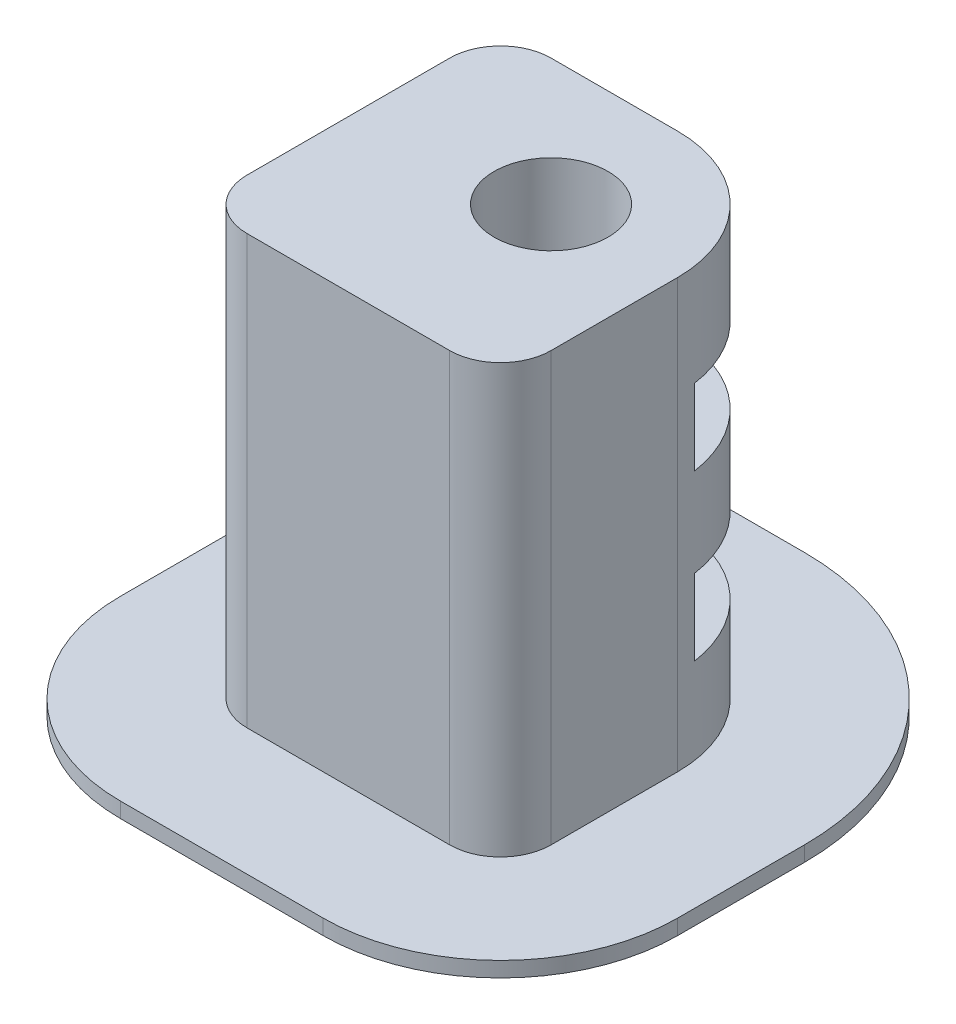
ISO-10303-21;
HEADER;
FILE_DESCRIPTION(('STEP AP214'),'2;1');
FILE_NAME('part.step','',(''),(''),'','','');
FILE_SCHEMA(('AUTOMOTIVE_DESIGN { 1 0 10303 214 1 1 1 1 }'));
ENDSEC;
DATA;
#1=APPLICATION_CONTEXT('core data for automotive mechanical design processes');
#2=APPLICATION_PROTOCOL_DEFINITION('international standard','automotive_design',2000,#1);
#3=PRODUCT_CONTEXT('',#1,'mechanical');
#4=PRODUCT('Part','Part','',(#3));
#5=PRODUCT_RELATED_PRODUCT_CATEGORY('part','',(#4));
#6=PRODUCT_DEFINITION_FORMATION('','',#4);
#7=PRODUCT_DEFINITION_CONTEXT('part definition',#1,'design');
#8=PRODUCT_DEFINITION('design','',#6,#7);
#9=PRODUCT_DEFINITION_SHAPE('','',#8);
#10=(LENGTH_UNIT() NAMED_UNIT(*) SI_UNIT(.MILLI.,.METRE.));
#11=(NAMED_UNIT(*) PLANE_ANGLE_UNIT() SI_UNIT($,.RADIAN.));
#12=(NAMED_UNIT(*) SI_UNIT($,.STERADIAN.) SOLID_ANGLE_UNIT());
#13=UNCERTAINTY_MEASURE_WITH_UNIT(LENGTH_MEASURE(1.E-05),#10,'distance_accuracy_value','');
#14=(GEOMETRIC_REPRESENTATION_CONTEXT(3) GLOBAL_UNCERTAINTY_ASSIGNED_CONTEXT((#13)) GLOBAL_UNIT_ASSIGNED_CONTEXT((#10,
#11,#12)) REPRESENTATION_CONTEXT('',''));
#15=CARTESIAN_POINT('',(0.,0.,0.));
#16=DIRECTION('',(0.,0.,1.));
#17=DIRECTION('',(1.,0.,0.));
#18=AXIS2_PLACEMENT_3D('',#15,#16,#17);
#19=CARTESIAN_POINT('',(0.,8.75,0.));
#20=DIRECTION('',(0.,-1.,0.));
#21=DIRECTION('',(0.,0.,-1.));
#22=AXIS2_PLACEMENT_3D('',#19,#20,#21);
#23=CYLINDRICAL_SURFACE('',#22,5.);
#24=CARTESIAN_POINT('',(0.,-1.75,0.));
#25=DIRECTION('',(0.,-1.,0.));
#26=DIRECTION('',(0.,0.,-1.));
#27=AXIS2_PLACEMENT_3D('',#24,#25,#26);
#28=CIRCLE('',#27,5.);
#29=CARTESIAN_POINT('',(0.707106781168826,-1.75,-4.94974746830836));
#30=VERTEX_POINT('',#29);
#31=CARTESIAN_POINT('',(4.94974746830585,-1.75,-0.707106781186403));
#32=VERTEX_POINT('',#31);
#33=EDGE_CURVE('E332',#30,#32,#28,.T.);
#34=ORIENTED_EDGE('',*,*,#33,.F.);
#35=DIRECTION('',(0.,-1.,0.));
#36=VECTOR('',#35,1.);
#37=CARTESIAN_POINT('',(0.707106781133654,8.75,-4.94974746831339));
#38=LINE('',#37,#36);
#39=CARTESIAN_POINT('',(0.707106781124861,-4.75,-4.94974746831465));
#40=VERTEX_POINT('',#39);
#41=EDGE_CURVE('E418',#30,#40,#38,.T.);
#42=ORIENTED_EDGE('',*,*,#41,.T.);
#43=CARTESIAN_POINT('',(0.,-4.75,0.));
#44=DIRECTION('',(0.,-1.,0.));
#45=DIRECTION('',(0.,0.,-1.));
#46=AXIS2_PLACEMENT_3D('',#43,#44,#45);
#47=CIRCLE('',#46,5.);
#48=CARTESIAN_POINT('',(4.94974746830837,-4.75,-0.707106781168817));
#49=VERTEX_POINT('',#48);
#50=EDGE_CURVE('E328',#40,#49,#47,.T.);
#51=ORIENTED_EDGE('',*,*,#50,.T.);
#52=DIRECTION('',(0.,-1.,0.));
#53=VECTOR('',#52,1.);
#54=CARTESIAN_POINT('',(4.94974746830836,8.75,-0.707106781168816));
#55=LINE('',#54,#53);
#56=EDGE_CURVE('E40',#49,#32,#55,.F.);
#57=ORIENTED_EDGE('',*,*,#56,.T.);
#58=EDGE_LOOP('',(#34,#42,#51,#57));
#59=FACE_BOUND('',#58,.T.);
#60=DIRECTION('',(0.,-1.,0.));
#61=VECTOR('',#60,1.);
#62=CARTESIAN_POINT('',(0.707106781274334,8.75,-4.94974746829329));
#63=LINE('',#62,#61);
#64=CARTESIAN_POINT('',(0.707106781168826,1.75,-4.94974746830836));
#65=VERTEX_POINT('',#64);
#66=CARTESIAN_POINT('',(0.707106781239164,4.75,-4.94974746829832));
#67=VERTEX_POINT('',#66);
#68=EDGE_CURVE('E415',#65,#67,#63,.F.);
#69=ORIENTED_EDGE('',*,*,#68,.F.);
#70=CARTESIAN_POINT('',(0.,1.75,0.));
#71=DIRECTION('',(0.,-1.,0.));
#72=DIRECTION('',(0.,0.,-1.));
#73=AXIS2_PLACEMENT_3D('',#70,#71,#72);
#74=CIRCLE('',#73,5.);
#75=CARTESIAN_POINT('',(4.94974746829832,1.75,-0.707106781239158));
#76=VERTEX_POINT('',#75);
#77=EDGE_CURVE('E364',#65,#76,#74,.T.);
#78=ORIENTED_EDGE('',*,*,#77,.T.);
#79=DIRECTION('',(0.,-1.,0.));
#80=VECTOR('',#79,1.);
#81=CARTESIAN_POINT('',(4.94974746831339,8.75,-0.707106781133646));
#82=LINE('',#81,#80);
#83=CARTESIAN_POINT('',(4.94974746830334,4.75,-0.707106781203987));
#84=VERTEX_POINT('',#83);
#85=EDGE_CURVE('E411',#84,#76,#82,.T.);
#86=ORIENTED_EDGE('',*,*,#85,.F.);
#87=CARTESIAN_POINT('',(0.,4.75,0.));
#88=DIRECTION('',(0.,-1.,0.));
#89=DIRECTION('',(0.,0.,-1.));
#90=AXIS2_PLACEMENT_3D('',#87,#88,#89);
#91=CIRCLE('',#90,5.);
#92=EDGE_CURVE('E361',#67,#84,#91,.T.);
#93=ORIENTED_EDGE('',*,*,#92,.F.);
#94=EDGE_LOOP('',(#69,#78,#86,#93));
#95=FACE_BOUND('',#94,.T.);
#96=CARTESIAN_POINT('',(0.,-8.15,0.));
#97=DIRECTION('',(0.,-1.,0.));
#98=DIRECTION('',(0.,0.,-1.));
#99=AXIS2_PLACEMENT_3D('',#96,#97,#98);
#100=CIRCLE('',#99,5.);
#101=CARTESIAN_POINT('',(0.,-8.15,-5.));
#102=VERTEX_POINT('',#101);
#103=CARTESIAN_POINT('',(5.,-8.15,0.));
#104=VERTEX_POINT('',#103);
#105=EDGE_CURVE('E282',#102,#104,#100,.T.);
#106=ORIENTED_EDGE('',*,*,#105,.F.);
#107=DIRECTION('',(0.,-1.,0.));
#108=VECTOR('',#107,1.);
#109=CARTESIAN_POINT('',(0.,8.75,-5.));
#110=LINE('',#109,#108);
#111=CARTESIAN_POINT('',(0.,8.75,-5.));
#112=VERTEX_POINT('',#111);
#113=EDGE_CURVE('E387',#112,#102,#110,.T.);
#114=ORIENTED_EDGE('',*,*,#113,.F.);
#115=CARTESIAN_POINT('',(0.,8.75,0.));
#116=DIRECTION('',(0.,1.,0.));
#117=DIRECTION('',(0.,0.,1.));
#118=AXIS2_PLACEMENT_3D('',#115,#116,#117);
#119=CIRCLE('',#118,5.);
#120=CARTESIAN_POINT('',(5.,8.75,0.));
#121=VERTEX_POINT('',#120);
#122=EDGE_CURVE('E370',#121,#112,#119,.T.);
#123=ORIENTED_EDGE('',*,*,#122,.F.);
#124=DIRECTION('',(0.,-1.,0.));
#125=VECTOR('',#124,1.);
#126=CARTESIAN_POINT('',(5.,8.75,0.));
#127=LINE('',#126,#125);
#128=EDGE_CURVE('E384',#121,#104,#127,.T.);
#129=ORIENTED_EDGE('',*,*,#128,.T.);
#130=EDGE_LOOP('',(#106,#114,#123,#129));
#131=FACE_BOUND('',#130,.T.);
#132=ADVANCED_FACE('F32',(#59,#95,#131),#23,.T.);
#133=CARTESIAN_POINT('',(0.,8.75,-5.));
#134=DIRECTION('',(0.,0.,1.));
#135=DIRECTION('',(1.,0.,0.));
#136=AXIS2_PLACEMENT_3D('',#133,#134,#135);
#137=PLANE('',#136);
#138=DIRECTION('',(1.,0.,0.));
#139=VECTOR('',#138,1.);
#140=CARTESIAN_POINT('',(0.,-8.15,-5.));
#141=LINE('',#140,#139);
#142=CARTESIAN_POINT('',(-5.,-8.15,-5.));
#143=VERTEX_POINT('',#142);
#144=EDGE_CURVE('E280',#143,#102,#141,.T.);
#145=ORIENTED_EDGE('',*,*,#144,.F.);
#146=DIRECTION('',(0.,-1.,0.));
#147=VECTOR('',#146,1.);
#148=CARTESIAN_POINT('',(-5.,8.75,-5.));
#149=LINE('',#148,#147);
#150=CARTESIAN_POINT('',(-5.,8.75,-5.));
#151=VERTEX_POINT('',#150);
#152=EDGE_CURVE('E409',#143,#151,#149,.F.);
#153=ORIENTED_EDGE('',*,*,#152,.T.);
#154=DIRECTION('',(-1.,0.,0.));
#155=VECTOR('',#154,1.);
#156=CARTESIAN_POINT('',(0.,8.75,-5.));
#157=LINE('',#156,#155);
#158=EDGE_CURVE('E373',#112,#151,#157,.T.);
#159=ORIENTED_EDGE('',*,*,#158,.F.);
#160=ORIENTED_EDGE('',*,*,#113,.T.);
#161=EDGE_LOOP('',(#145,#153,#159,#160));
#162=FACE_BOUND('',#161,.T.);
#163=ADVANCED_FACE('F471',(#162),#137,.F.);
#164=CARTESIAN_POINT('',(-7.,8.75,-5.));
#165=DIRECTION('',(1.,0.,0.));
#166=DIRECTION('',(0.,0.,-1.));
#167=AXIS2_PLACEMENT_3D('',#164,#165,#166);
#168=PLANE('',#167);
#169=DIRECTION('',(0.,0.,-1.));
#170=VECTOR('',#169,1.);
#171=CARTESIAN_POINT('',(-7.,-8.15,-5.));
#172=LINE('',#171,#170);
#173=CARTESIAN_POINT('',(-7.,-8.15,5.));
#174=VERTEX_POINT('',#173);
#175=CARTESIAN_POINT('',(-7.,-8.15,-3.));
#176=VERTEX_POINT('',#175);
#177=EDGE_CURVE('E47',#174,#176,#172,.T.);
#178=ORIENTED_EDGE('',*,*,#177,.F.);
#179=DIRECTION('',(0.,-1.,0.));
#180=VECTOR('',#179,1.);
#181=CARTESIAN_POINT('',(-7.,8.75,5.));
#182=LINE('',#181,#180);
#183=CARTESIAN_POINT('',(-7.,8.75,5.));
#184=VERTEX_POINT('',#183);
#185=EDGE_CURVE('E407',#174,#184,#182,.F.);
#186=ORIENTED_EDGE('',*,*,#185,.T.);
#187=DIRECTION('',(0.,0.,1.));
#188=VECTOR('',#187,1.);
#189=CARTESIAN_POINT('',(-7.,8.75,-5.));
#190=LINE('',#189,#188);
#191=CARTESIAN_POINT('',(-7.,8.75,-3.));
#192=VERTEX_POINT('',#191);
#193=EDGE_CURVE('E376',#192,#184,#190,.T.);
#194=ORIENTED_EDGE('',*,*,#193,.F.);
#195=DIRECTION('',(0.,-1.,0.));
#196=VECTOR('',#195,1.);
#197=CARTESIAN_POINT('',(-7.,8.75,-3.));
#198=LINE('',#197,#196);
#199=EDGE_CURVE('E404',#192,#176,#198,.T.);
#200=ORIENTED_EDGE('',*,*,#199,.T.);
#201=EDGE_LOOP('',(#178,#186,#194,#200));
#202=FACE_BOUND('',#201,.T.);
#203=ADVANCED_FACE('F477',(#202),#168,.F.);
#204=CARTESIAN_POINT('',(-7.,8.75,7.));
#205=DIRECTION('',(0.,0.,-1.));
#206=DIRECTION('',(-1.,0.,0.));
#207=AXIS2_PLACEMENT_3D('',#204,#205,#206);
#208=PLANE('',#207);
#209=DIRECTION('',(-1.,0.,0.));
#210=VECTOR('',#209,1.);
#211=CARTESIAN_POINT('',(-7.,-8.15,7.));
#212=LINE('',#211,#210);
#213=CARTESIAN_POINT('',(3.,-8.15,7.));
#214=VERTEX_POINT('',#213);
#215=CARTESIAN_POINT('',(-5.,-8.15,7.));
#216=VERTEX_POINT('',#215);
#217=EDGE_CURVE('E289',#214,#216,#212,.T.);
#218=ORIENTED_EDGE('',*,*,#217,.F.);
#219=DIRECTION('',(0.,-1.,0.));
#220=VECTOR('',#219,1.);
#221=CARTESIAN_POINT('',(3.,8.75,7.));
#222=LINE('',#221,#220);
#223=CARTESIAN_POINT('',(3.,8.75,7.));
#224=VERTEX_POINT('',#223);
#225=EDGE_CURVE('E396',#214,#224,#222,.F.);
#226=ORIENTED_EDGE('',*,*,#225,.T.);
#227=DIRECTION('',(1.,0.,0.));
#228=VECTOR('',#227,1.);
#229=CARTESIAN_POINT('',(-7.,8.75,7.));
#230=LINE('',#229,#228);
#231=CARTESIAN_POINT('',(-5.,8.75,7.));
#232=VERTEX_POINT('',#231);
#233=EDGE_CURVE('E379',#232,#224,#230,.T.);
#234=ORIENTED_EDGE('',*,*,#233,.F.);
#235=DIRECTION('',(0.,-1.,0.));
#236=VECTOR('',#235,1.);
#237=CARTESIAN_POINT('',(-5.,8.75,7.));
#238=LINE('',#237,#236);
#239=EDGE_CURVE('E393',#232,#216,#238,.T.);
#240=ORIENTED_EDGE('',*,*,#239,.T.);
#241=EDGE_LOOP('',(#218,#226,#234,#240));
#242=FACE_BOUND('',#241,.T.);
#243=ADVANCED_FACE('F519',(#242),#208,.F.);
#244=CARTESIAN_POINT('',(5.,8.75,7.));
#245=DIRECTION('',(-1.,0.,0.));
#246=DIRECTION('',(0.,0.,1.));
#247=AXIS2_PLACEMENT_3D('',#244,#245,#246);
#248=PLANE('',#247);
#249=DIRECTION('',(0.,0.,1.));
#250=VECTOR('',#249,1.);
#251=CARTESIAN_POINT('',(5.,-8.15,7.));
#252=LINE('',#251,#250);
#253=CARTESIAN_POINT('',(5.,-8.15,5.));
#254=VERTEX_POINT('',#253);
#255=EDGE_CURVE('E287',#104,#254,#252,.T.);
#256=ORIENTED_EDGE('',*,*,#255,.F.);
#257=ORIENTED_EDGE('',*,*,#128,.F.);
#258=DIRECTION('',(0.,0.,-1.));
#259=VECTOR('',#258,1.);
#260=CARTESIAN_POINT('',(5.,8.75,7.));
#261=LINE('',#260,#259);
#262=CARTESIAN_POINT('',(5.,8.75,5.));
#263=VERTEX_POINT('',#262);
#264=EDGE_CURVE('E382',#263,#121,#261,.T.);
#265=ORIENTED_EDGE('',*,*,#264,.F.);
#266=DIRECTION('',(0.,-1.,0.));
#267=VECTOR('',#266,1.);
#268=CARTESIAN_POINT('',(5.,8.75,5.));
#269=LINE('',#268,#267);
#270=EDGE_CURVE('E390',#263,#254,#269,.T.);
#271=ORIENTED_EDGE('',*,*,#270,.T.);
#272=EDGE_LOOP('',(#256,#257,#265,#271));
#273=FACE_BOUND('',#272,.T.);
#274=ADVANCED_FACE('F486',(#273),#248,.F.);
#275=CARTESIAN_POINT('',(3.,8.75,5.));
#276=DIRECTION('',(0.,-1.,0.));
#277=DIRECTION('',(0.,0.,-1.));
#278=AXIS2_PLACEMENT_3D('',#275,#276,#277);
#279=CYLINDRICAL_SURFACE('',#278,2.);
#280=ORIENTED_EDGE('',*,*,#225,.F.);
#281=CARTESIAN_POINT('',(3.,-8.15,5.));
#282=DIRECTION('',(0.,-1.,0.));
#283=DIRECTION('',(0.,0.,-1.));
#284=AXIS2_PLACEMENT_3D('',#281,#282,#283);
#285=CIRCLE('',#284,2.);
#286=EDGE_CURVE('E291',#214,#254,#285,.F.);
#287=ORIENTED_EDGE('',*,*,#286,.T.);
#288=ORIENTED_EDGE('',*,*,#270,.F.);
#289=CARTESIAN_POINT('',(3.,8.75,5.));
#290=DIRECTION('',(0.,1.,0.));
#291=DIRECTION('',(0.,0.,1.));
#292=AXIS2_PLACEMENT_3D('',#289,#290,#291);
#293=CIRCLE('',#292,2.);
#294=EDGE_CURVE('E402',#224,#263,#293,.T.);
#295=ORIENTED_EDGE('',*,*,#294,.F.);
#296=EDGE_LOOP('',(#280,#287,#288,#295));
#297=FACE_BOUND('',#296,.T.);
#298=ADVANCED_FACE('F483',(#297),#279,.T.);
#299=CARTESIAN_POINT('',(-5.,8.75,5.));
#300=DIRECTION('',(0.,-1.,0.));
#301=DIRECTION('',(0.,0.,-1.));
#302=AXIS2_PLACEMENT_3D('',#299,#300,#301);
#303=CYLINDRICAL_SURFACE('',#302,2.);
#304=ORIENTED_EDGE('',*,*,#185,.F.);
#305=CARTESIAN_POINT('',(-5.,-8.15,5.));
#306=DIRECTION('',(0.,-1.,0.));
#307=DIRECTION('',(0.,0.,-1.));
#308=AXIS2_PLACEMENT_3D('',#305,#306,#307);
#309=CIRCLE('',#308,2.);
#310=EDGE_CURVE('E284',#174,#216,#309,.F.);
#311=ORIENTED_EDGE('',*,*,#310,.T.);
#312=ORIENTED_EDGE('',*,*,#239,.F.);
#313=CARTESIAN_POINT('',(-5.,8.75,5.));
#314=DIRECTION('',(0.,1.,0.));
#315=DIRECTION('',(0.,0.,1.));
#316=AXIS2_PLACEMENT_3D('',#313,#314,#315);
#317=CIRCLE('',#316,2.);
#318=EDGE_CURVE('E400',#184,#232,#317,.T.);
#319=ORIENTED_EDGE('',*,*,#318,.F.);
#320=EDGE_LOOP('',(#304,#311,#312,#319));
#321=FACE_BOUND('',#320,.T.);
#322=ADVANCED_FACE('F485',(#321),#303,.T.);
#323=CARTESIAN_POINT('',(-5.,8.75,-3.));
#324=DIRECTION('',(0.,-1.,0.));
#325=DIRECTION('',(0.,0.,-1.));
#326=AXIS2_PLACEMENT_3D('',#323,#324,#325);
#327=CYLINDRICAL_SURFACE('',#326,2.);
#328=ORIENTED_EDGE('',*,*,#152,.F.);
#329=CARTESIAN_POINT('',(-5.,-8.15,-3.));
#330=DIRECTION('',(0.,-1.,0.));
#331=DIRECTION('',(0.,0.,-1.));
#332=AXIS2_PLACEMENT_3D('',#329,#330,#331);
#333=CIRCLE('',#332,2.);
#334=EDGE_CURVE('E11',#143,#176,#333,.F.);
#335=ORIENTED_EDGE('',*,*,#334,.T.);
#336=ORIENTED_EDGE('',*,*,#199,.F.);
#337=CARTESIAN_POINT('',(-5.,8.75,-3.));
#338=DIRECTION('',(0.,1.,0.));
#339=DIRECTION('',(0.,0.,1.));
#340=AXIS2_PLACEMENT_3D('',#337,#338,#339);
#341=CIRCLE('',#340,2.);
#342=EDGE_CURVE('E398',#151,#192,#341,.T.);
#343=ORIENTED_EDGE('',*,*,#342,.F.);
#344=EDGE_LOOP('',(#328,#335,#336,#343));
#345=FACE_BOUND('',#344,.T.);
#346=ADVANCED_FACE('F34',(#345),#327,.T.);
#347=CARTESIAN_POINT('',(0.,8.75,0.));
#348=DIRECTION('',(0.,-1.,0.));
#349=DIRECTION('',(0.,0.,-1.));
#350=AXIS2_PLACEMENT_3D('',#347,#348,#349);
#351=CYLINDRICAL_SURFACE('',#350,1.6);
#352=CARTESIAN_POINT('',(0.,1.75,0.));
#353=DIRECTION('',(0.,-1.,0.));
#354=DIRECTION('',(0.,0.,-1.));
#355=AXIS2_PLACEMENT_3D('',#352,#353,#354);
#356=CIRCLE('',#355,1.6);
#357=CARTESIAN_POINT('',(0.,1.75,-1.6));
#358=VERTEX_POINT('',#357);
#359=EDGE_CURVE('E363',#358,#358,#356,.T.);
#360=ORIENTED_EDGE('',*,*,#359,.F.);
#361=EDGE_LOOP('',(#360));
#362=FACE_BOUND('',#361,.T.);
#363=CARTESIAN_POINT('',(0.,-1.75,0.));
#364=DIRECTION('',(0.,-1.,0.));
#365=DIRECTION('',(0.,0.,-1.));
#366=AXIS2_PLACEMENT_3D('',#363,#364,#365);
#367=CIRCLE('',#366,1.6);
#368=CARTESIAN_POINT('',(0.,-1.75,-1.6));
#369=VERTEX_POINT('',#368);
#370=EDGE_CURVE('E331',#369,#369,#367,.T.);
#371=ORIENTED_EDGE('',*,*,#370,.T.);
#372=EDGE_LOOP('',(#371));
#373=FACE_BOUND('',#372,.T.);
#374=ADVANCED_FACE('F493',(#362,#373),#351,.F.);
#375=CARTESIAN_POINT('',(0.,8.75,0.));
#376=DIRECTION('',(0.,1.,0.));
#377=DIRECTION('',(0.,0.,1.));
#378=AXIS2_PLACEMENT_3D('',#375,#376,#377);
#379=PLANE('',#378);
#380=CARTESIAN_POINT('',(0.,8.75,0.));
#381=DIRECTION('',(0.,1.,0.));
#382=DIRECTION('',(0.,0.,1.));
#383=AXIS2_PLACEMENT_3D('',#380,#381,#382);
#384=CIRCLE('',#383,2.25);
#385=CARTESIAN_POINT('',(0.,8.75,2.25));
#386=VERTEX_POINT('',#385);
#387=EDGE_CURVE('E294',#386,#386,#384,.T.);
#388=ORIENTED_EDGE('',*,*,#387,.F.);
#389=EDGE_LOOP('',(#388));
#390=FACE_BOUND('',#389,.T.);
#391=ORIENTED_EDGE('',*,*,#233,.T.);
#392=ORIENTED_EDGE('',*,*,#294,.T.);
#393=ORIENTED_EDGE('',*,*,#264,.T.);
#394=ORIENTED_EDGE('',*,*,#122,.T.);
#395=ORIENTED_EDGE('',*,*,#158,.T.);
#396=ORIENTED_EDGE('',*,*,#342,.T.);
#397=ORIENTED_EDGE('',*,*,#193,.T.);
#398=ORIENTED_EDGE('',*,*,#318,.T.);
#399=EDGE_LOOP('',(#391,#392,#393,#394,#395,#396,#397,#398));
#400=FACE_BOUND('',#399,.T.);
#401=ADVANCED_FACE('F502',(#390,#400),#379,.T.);
#402=CARTESIAN_POINT('',(0.,-8.75,0.));
#403=DIRECTION('',(0.,1.,0.));
#404=DIRECTION('',(0.,0.,1.));
#405=AXIS2_PLACEMENT_3D('',#402,#403,#404);
#406=PLANE('',#405);
#407=CARTESIAN_POINT('',(0.,-8.75,0.));
#408=DIRECTION('',(0.,1.,0.));
#409=DIRECTION('',(0.,0.,1.));
#410=AXIS2_PLACEMENT_3D('',#407,#408,#409);
#411=CIRCLE('',#410,1.6);
#412=CARTESIAN_POINT('',(0.,-8.75,1.6));
#413=VERTEX_POINT('',#412);
#414=EDGE_CURVE('E367',#413,#413,#411,.T.);
#415=ORIENTED_EDGE('',*,*,#414,.T.);
#416=EDGE_LOOP('',(#415));
#417=FACE_BOUND('',#416,.T.);
#418=CARTESIAN_POINT('',(3.,-8.75,5.));
#419=DIRECTION('',(0.,-1.,0.));
#420=DIRECTION('',(0.,0.,-1.));
#421=AXIS2_PLACEMENT_3D('',#418,#419,#420);
#422=CIRCLE('',#421,7.);
#423=CARTESIAN_POINT('',(10.,-8.75,5.));
#424=VERTEX_POINT('',#423);
#425=CARTESIAN_POINT('',(3.,-8.75,12.));
#426=VERTEX_POINT('',#425);
#427=EDGE_CURVE('E250',#424,#426,#422,.T.);
#428=ORIENTED_EDGE('',*,*,#427,.T.);
#429=DIRECTION('',(-1.,0.,0.));
#430=VECTOR('',#429,1.);
#431=CARTESIAN_POINT('',(3.,-8.75,12.));
#432=LINE('',#431,#430);
#433=CARTESIAN_POINT('',(-5.,-8.75,12.));
#434=VERTEX_POINT('',#433);
#435=EDGE_CURVE('E209',#426,#434,#432,.T.);
#436=ORIENTED_EDGE('',*,*,#435,.T.);
#437=CARTESIAN_POINT('',(-5.,-8.75,5.));
#438=DIRECTION('',(0.,-1.,0.));
#439=DIRECTION('',(0.,0.,-1.));
#440=AXIS2_PLACEMENT_3D('',#437,#438,#439);
#441=CIRCLE('',#440,7.);
#442=CARTESIAN_POINT('',(-12.,-8.75,5.));
#443=VERTEX_POINT('',#442);
#444=EDGE_CURVE('E253',#434,#443,#441,.T.);
#445=ORIENTED_EDGE('',*,*,#444,.T.);
#446=DIRECTION('',(0.,0.,-1.));
#447=VECTOR('',#446,1.);
#448=CARTESIAN_POINT('',(-12.,-8.75,5.));
#449=LINE('',#448,#447);
#450=CARTESIAN_POINT('',(-12.,-8.75,-3.));
#451=VERTEX_POINT('',#450);
#452=EDGE_CURVE('E256',#443,#451,#449,.T.);
#453=ORIENTED_EDGE('',*,*,#452,.T.);
#454=CARTESIAN_POINT('',(-5.,-8.75,-3.));
#455=DIRECTION('',(0.,-1.,0.));
#456=DIRECTION('',(0.,0.,-1.));
#457=AXIS2_PLACEMENT_3D('',#454,#455,#456);
#458=CIRCLE('',#457,7.);
#459=CARTESIAN_POINT('',(-5.,-8.75,-10.));
#460=VERTEX_POINT('',#459);
#461=EDGE_CURVE('E259',#451,#460,#458,.T.);
#462=ORIENTED_EDGE('',*,*,#461,.T.);
#463=DIRECTION('',(1.,0.,0.));
#464=VECTOR('',#463,1.);
#465=CARTESIAN_POINT('',(-5.,-8.75,-10.));
#466=LINE('',#465,#464);
#467=CARTESIAN_POINT('',(0.,-8.75,-10.));
#468=VERTEX_POINT('',#467);
#469=EDGE_CURVE('E262',#460,#468,#466,.T.);
#470=ORIENTED_EDGE('',*,*,#469,.T.);
#471=CARTESIAN_POINT('',(0.,-8.75,0.));
#472=DIRECTION('',(0.,-1.,0.));
#473=DIRECTION('',(0.,0.,-1.));
#474=AXIS2_PLACEMENT_3D('',#471,#472,#473);
#475=CIRCLE('',#474,10.);
#476=CARTESIAN_POINT('',(10.,-8.75,0.));
#477=VERTEX_POINT('',#476);
#478=EDGE_CURVE('E233',#468,#477,#475,.T.);
#479=ORIENTED_EDGE('',*,*,#478,.T.);
#480=DIRECTION('',(0.,0.,1.));
#481=VECTOR('',#480,1.);
#482=CARTESIAN_POINT('',(10.,-8.75,0.));
#483=LINE('',#482,#481);
#484=EDGE_CURVE('E230',#477,#424,#483,.T.);
#485=ORIENTED_EDGE('',*,*,#484,.T.);
#486=EDGE_LOOP('',(#428,#436,#445,#453,#462,#470,#479,#485));
#487=FACE_BOUND('',#486,.T.);
#488=ADVANCED_FACE('F528',(#417,#487),#406,.F.);
#489=ORIENTED_EDGE('',*,*,#414,.F.);
#490=EDGE_LOOP('',(#489));
#491=FACE_BOUND('',#490,.T.);
#492=CARTESIAN_POINT('',(0.,-4.75,0.));
#493=DIRECTION('',(0.,-1.,0.));
#494=DIRECTION('',(0.,0.,-1.));
#495=AXIS2_PLACEMENT_3D('',#492,#493,#494);
#496=CIRCLE('',#495,1.6);
#497=CARTESIAN_POINT('',(0.,-4.75,-1.6));
#498=VERTEX_POINT('',#497);
#499=EDGE_CURVE('E323',#498,#498,#496,.T.);
#500=ORIENTED_EDGE('',*,*,#499,.F.);
#501=EDGE_LOOP('',(#500));
#502=FACE_BOUND('',#501,.T.);
#503=ADVANCED_FACE('F531',(#491,#502),#351,.F.);
#504=CARTESIAN_POINT('',(-345799.821320344,1.75,345795.578679656));
#505=DIRECTION('',(0.707106781186547,0.,0.707106781186548));
#506=DIRECTION('',(0.707106781186548,0.,-0.707106781186547));
#507=AXIS2_PLACEMENT_3D('',#504,#505,#506);
#508=PLANE('',#507);
#509=ORIENTED_EDGE('',*,*,#68,.T.);
#510=DIRECTION('',(0.707106781186548,0.,-0.707106781186547));
#511=VECTOR('',#510,1.);
#512=CARTESIAN_POINT('',(-345799.821320344,4.75,345795.578679656));
#513=LINE('',#512,#511);
#514=CARTESIAN_POINT('',(-3.34606521494152,4.75,-0.896575472154382));
#515=VERTEX_POINT('',#514);
#516=EDGE_CURVE('E350',#515,#67,#513,.T.);
#517=ORIENTED_EDGE('',*,*,#516,.F.);
#518=DIRECTION('',(0.,1.,0.));
#519=VECTOR('',#518,1.);
#520=CARTESIAN_POINT('',(-3.34606521494152,1.75,-0.896575472154382));
#521=LINE('',#520,#519);
#522=CARTESIAN_POINT('',(-3.34606521494152,1.75,-0.896575472154382));
#523=VERTEX_POINT('',#522);
#524=EDGE_CURVE('E345',#523,#515,#521,.T.);
#525=ORIENTED_EDGE('',*,*,#524,.F.);
#526=DIRECTION('',(0.707106781186548,0.,-0.707106781186547));
#527=VECTOR('',#526,1.);
#528=CARTESIAN_POINT('',(-345799.821320344,1.75,345795.578679656));
#529=LINE('',#528,#527);
#530=EDGE_CURVE('E342',#523,#65,#529,.T.);
#531=ORIENTED_EDGE('',*,*,#530,.T.);
#532=EDGE_LOOP('',(#509,#517,#525,#531));
#533=FACE_BOUND('',#532,.T.);
#534=ADVANCED_FACE('F456',(#533),#508,.T.);
#535=CARTESIAN_POINT('',(-345795.578679657,1.75,345799.821320343));
#536=DIRECTION('',(-0.707106781186547,0.,-0.707106781186548));
#537=DIRECTION('',(-0.707106781186548,0.,0.707106781186547));
#538=AXIS2_PLACEMENT_3D('',#535,#536,#537);
#539=PLANE('',#538);
#540=ORIENTED_EDGE('',*,*,#85,.T.);
#541=DIRECTION('',(-0.707106781186548,0.,0.707106781186547));
#542=VECTOR('',#541,1.);
#543=CARTESIAN_POINT('',(-345795.578679657,1.75,345799.821320343));
#544=LINE('',#543,#542);
#545=CARTESIAN_POINT('',(0.896575472154382,1.75,3.34606521501257));
#546=VERTEX_POINT('',#545);
#547=EDGE_CURVE('E335',#76,#546,#544,.T.);
#548=ORIENTED_EDGE('',*,*,#547,.T.);
#549=DIRECTION('',(0.,1.,0.));
#550=VECTOR('',#549,1.);
#551=CARTESIAN_POINT('',(0.896575472154382,1.75,3.34606521501257));
#552=LINE('',#551,#550);
#553=CARTESIAN_POINT('',(0.896575472154382,4.75,3.34606521501257));
#554=VERTEX_POINT('',#553);
#555=EDGE_CURVE('E358',#546,#554,#552,.T.);
#556=ORIENTED_EDGE('',*,*,#555,.T.);
#557=DIRECTION('',(-0.707106781186548,0.,0.707106781186547));
#558=VECTOR('',#557,1.);
#559=CARTESIAN_POINT('',(-345795.578679657,4.75,345799.821320343));
#560=LINE('',#559,#558);
#561=EDGE_CURVE('E338',#84,#554,#560,.T.);
#562=ORIENTED_EDGE('',*,*,#561,.F.);
#563=EDGE_LOOP('',(#540,#548,#556,#562));
#564=FACE_BOUND('',#563,.T.);
#565=ADVANCED_FACE('F445',(#564),#539,.T.);
#566=CARTESIAN_POINT('',(0.,1.75,0.));
#567=DIRECTION('',(0.,-1.,0.));
#568=DIRECTION('',(0.,0.,-1.));
#569=AXIS2_PLACEMENT_3D('',#566,#567,#568);
#570=PLANE('',#569);
#571=ORIENTED_EDGE('',*,*,#530,.F.);
#572=DIRECTION('',(-0.25881904510252,0.,-0.965925826289068));
#573=VECTOR('',#572,1.);
#574=CARTESIAN_POINT('',(46100.7159921107,1.75,172061.805457776));
#575=LINE('',#574,#573);
#576=CARTESIAN_POINT('',(-2.44948974282266,1.75,2.44948974284398));
#577=VERTEX_POINT('',#576);
#578=EDGE_CURVE('E340',#577,#523,#575,.T.);
#579=ORIENTED_EDGE('',*,*,#578,.F.);
#580=DIRECTION('',(-0.965925826289068,0.,-0.25881904510252));
#581=VECTOR('',#580,1.);
#582=CARTESIAN_POINT('',(-300308.190226725,1.75,-80464.2312231616));
#583=LINE('',#582,#581);
#584=EDGE_CURVE('E337',#546,#577,#583,.T.);
#585=ORIENTED_EDGE('',*,*,#584,.F.);
#586=ORIENTED_EDGE('',*,*,#547,.F.);
#587=ORIENTED_EDGE('',*,*,#77,.F.);
#588=EDGE_LOOP('',(#571,#579,#585,#586,#587));
#589=FACE_BOUND('',#588,.T.);
#590=ORIENTED_EDGE('',*,*,#359,.T.);
#591=EDGE_LOOP('',(#590));
#592=FACE_BOUND('',#591,.T.);
#593=ADVANCED_FACE('F436',(#589,#592),#570,.F.);
#594=CARTESIAN_POINT('',(0.,4.75,0.));
#595=DIRECTION('',(0.,-1.,0.));
#596=DIRECTION('',(0.,0.,-1.));
#597=AXIS2_PLACEMENT_3D('',#594,#595,#596);
#598=PLANE('',#597);
#599=CARTESIAN_POINT('',(0.,4.75,0.));
#600=DIRECTION('',(0.,-1.,0.));
#601=DIRECTION('',(0.,0.,-1.));
#602=AXIS2_PLACEMENT_3D('',#599,#600,#601);
#603=CIRCLE('',#602,2.25);
#604=CARTESIAN_POINT('',(0.,4.75,-2.25));
#605=VERTEX_POINT('',#604);
#606=EDGE_CURVE('E297',#605,#605,#603,.T.);
#607=ORIENTED_EDGE('',*,*,#606,.F.);
#608=EDGE_LOOP('',(#607));
#609=FACE_BOUND('',#608,.T.);
#610=ORIENTED_EDGE('',*,*,#92,.T.);
#611=ORIENTED_EDGE('',*,*,#561,.T.);
#612=DIRECTION('',(-0.965925826289068,0.,-0.25881904510252));
#613=VECTOR('',#612,1.);
#614=CARTESIAN_POINT('',(-300308.190226725,4.75,-80464.2312231616));
#615=LINE('',#614,#613);
#616=CARTESIAN_POINT('',(-2.44948974282266,4.75,2.44948974284398));
#617=VERTEX_POINT('',#616);
#618=EDGE_CURVE('E334',#554,#617,#615,.T.);
#619=ORIENTED_EDGE('',*,*,#618,.T.);
#620=DIRECTION('',(-0.25881904510252,0.,-0.965925826289068));
#621=VECTOR('',#620,1.);
#622=CARTESIAN_POINT('',(46100.7159921107,4.75,172061.805457776));
#623=LINE('',#622,#621);
#624=EDGE_CURVE('E347',#617,#515,#623,.T.);
#625=ORIENTED_EDGE('',*,*,#624,.T.);
#626=ORIENTED_EDGE('',*,*,#516,.T.);
#627=EDGE_LOOP('',(#610,#611,#619,#625,#626));
#628=FACE_BOUND('',#627,.T.);
#629=ADVANCED_FACE('F432',(#609,#628),#598,.T.);
#630=CARTESIAN_POINT('',(-300308.190226725,1.75,-80464.2312231616));
#631=DIRECTION('',(0.25881904510252,0.,-0.965925826289068));
#632=DIRECTION('',(-0.965925826289068,0.,-0.25881904510252));
#633=AXIS2_PLACEMENT_3D('',#630,#631,#632);
#634=PLANE('',#633);
#635=ORIENTED_EDGE('',*,*,#618,.F.);
#636=ORIENTED_EDGE('',*,*,#555,.F.);
#637=ORIENTED_EDGE('',*,*,#584,.T.);
#638=DIRECTION('',(0.,1.,0.));
#639=VECTOR('',#638,1.);
#640=CARTESIAN_POINT('',(-2.44948974282266,1.75,2.44948974284398));
#641=LINE('',#640,#639);
#642=EDGE_CURVE('E355',#577,#617,#641,.T.);
#643=ORIENTED_EDGE('',*,*,#642,.T.);
#644=EDGE_LOOP('',(#635,#636,#637,#643));
#645=FACE_BOUND('',#644,.T.);
#646=ADVANCED_FACE('F435',(#645),#634,.T.);
#647=CARTESIAN_POINT('',(46100.7159921107,1.75,172061.805457776));
#648=DIRECTION('',(0.965925826289068,0.,-0.25881904510252));
#649=DIRECTION('',(-0.25881904510252,0.,-0.965925826289069));
#650=AXIS2_PLACEMENT_3D('',#647,#648,#649);
#651=PLANE('',#650);
#652=ORIENTED_EDGE('',*,*,#624,.F.);
#653=ORIENTED_EDGE('',*,*,#642,.F.);
#654=ORIENTED_EDGE('',*,*,#578,.T.);
#655=ORIENTED_EDGE('',*,*,#524,.T.);
#656=EDGE_LOOP('',(#652,#653,#654,#655));
#657=FACE_BOUND('',#656,.T.);
#658=ADVANCED_FACE('F459',(#657),#651,.T.);
#659=CARTESIAN_POINT('',(54204.421320344,-1.75,-54200.1786796567));
#660=DIRECTION('',(0.707106781186547,0.,0.707106781186548));
#661=DIRECTION('',(0.707106781186548,0.,-0.707106781186547));
#662=AXIS2_PLACEMENT_3D('',#659,#660,#661);
#663=PLANE('',#662);
#664=DIRECTION('',(-0.707106781186548,0.,0.707106781186547));
#665=VECTOR('',#664,1.);
#666=CARTESIAN_POINT('',(54204.421320344,-4.75,-54200.1786796567));
#667=LINE('',#666,#665);
#668=CARTESIAN_POINT('',(0.896575472211225,-4.75,3.34606521495573));
#669=VERTEX_POINT('',#668);
#670=EDGE_CURVE('E54',#49,#669,#667,.T.);
#671=ORIENTED_EDGE('',*,*,#670,.T.);
#672=DIRECTION('',(0.,-1.,0.));
#673=VECTOR('',#672,1.);
#674=CARTESIAN_POINT('',(0.896575472211225,-1.75,3.34606521495573));
#675=LINE('',#674,#673);
#676=CARTESIAN_POINT('',(0.896575472211225,-1.75,3.34606521495573));
#677=VERTEX_POINT('',#676);
#678=EDGE_CURVE('E309',#677,#669,#675,.T.);
#679=ORIENTED_EDGE('',*,*,#678,.F.);
#680=DIRECTION('',(-0.707106781186548,0.,0.707106781186547));
#681=VECTOR('',#680,1.);
#682=CARTESIAN_POINT('',(54204.4213203439,-1.75,-54200.1786796567));
#683=LINE('',#682,#681);
#684=EDGE_CURVE('E298',#32,#677,#683,.T.);
#685=ORIENTED_EDGE('',*,*,#684,.F.);
#686=ORIENTED_EDGE('',*,*,#56,.F.);
#687=EDGE_LOOP('',(#671,#679,#685,#686));
#688=FACE_BOUND('',#687,.T.);
#689=ADVANCED_FACE('F467',(#688),#663,.F.);
#690=CARTESIAN_POINT('',(54200.1786796565,-1.75,-54204.4213203437));
#691=DIRECTION('',(-0.707106781186547,0.,-0.707106781186548));
#692=DIRECTION('',(-0.707106781186548,0.,0.707106781186547));
#693=AXIS2_PLACEMENT_3D('',#690,#691,#692);
#694=PLANE('',#693);
#695=DIRECTION('',(0.707106781186548,0.,-0.707106781186547));
#696=VECTOR('',#695,1.);
#697=CARTESIAN_POINT('',(54200.1786796568,-1.75,-54204.4213203438));
#698=LINE('',#697,#696);
#699=CARTESIAN_POINT('',(-3.3460652149202,-1.75,-0.896575472211225));
#700=VERTEX_POINT('',#699);
#701=EDGE_CURVE('E306',#700,#30,#698,.T.);
#702=ORIENTED_EDGE('',*,*,#701,.F.);
#703=DIRECTION('',(0.,-1.,0.));
#704=VECTOR('',#703,1.);
#705=CARTESIAN_POINT('',(-3.3460652149202,-1.75,-0.896575472211225));
#706=LINE('',#705,#704);
#707=CARTESIAN_POINT('',(-3.3460652149202,-4.75,-0.896575472211225));
#708=VERTEX_POINT('',#707);
#709=EDGE_CURVE('E320',#700,#708,#706,.T.);
#710=ORIENTED_EDGE('',*,*,#709,.T.);
#711=DIRECTION('',(0.707106781186548,0.,-0.707106781186547));
#712=VECTOR('',#711,1.);
#713=CARTESIAN_POINT('',(54200.1786796565,-4.75,-54204.4213203437));
#714=LINE('',#713,#712);
#715=EDGE_CURVE('E316',#708,#40,#714,.T.);
#716=ORIENTED_EDGE('',*,*,#715,.T.);
#717=ORIENTED_EDGE('',*,*,#41,.F.);
#718=EDGE_LOOP('',(#702,#710,#716,#717));
#719=FACE_BOUND('',#718,.T.);
#720=ADVANCED_FACE('F555',(#719),#694,.F.);
#721=CARTESIAN_POINT('',(0.,-1.75,0.));
#722=DIRECTION('',(0.,-1.,0.));
#723=DIRECTION('',(0.,0.,-1.));
#724=AXIS2_PLACEMENT_3D('',#721,#722,#723);
#725=PLANE('',#724);
#726=ORIENTED_EDGE('',*,*,#370,.F.);
#727=EDGE_LOOP('',(#726));
#728=FACE_BOUND('',#727,.T.);
#729=ORIENTED_EDGE('',*,*,#33,.T.);
#730=ORIENTED_EDGE('',*,*,#684,.T.);
#731=DIRECTION('',(-0.965925826289068,0.,-0.25881904510252));
#732=VECTOR('',#731,1.);
#733=CARTESIAN_POINT('',(446101.971287051,-1.75,119535.768776838));
#734=LINE('',#733,#732);
#735=CARTESIAN_POINT('',(-2.44948974271608,-1.75,2.44948974284398));
#736=VERTEX_POINT('',#735);
#737=EDGE_CURVE('E300',#677,#736,#734,.T.);
#738=ORIENTED_EDGE('',*,*,#737,.T.);
#739=DIRECTION('',(-0.25881904510252,0.,-0.965925826289068));
#740=VECTOR('',#739,1.);
#741=CARTESIAN_POINT('',(99690.5544783352,-1.75,372061.805457776));
#742=LINE('',#741,#740);
#743=EDGE_CURVE('E303',#736,#700,#742,.T.);
#744=ORIENTED_EDGE('',*,*,#743,.T.);
#745=ORIENTED_EDGE('',*,*,#701,.T.);
#746=EDGE_LOOP('',(#729,#730,#738,#744,#745));
#747=FACE_BOUND('',#746,.T.);
#748=ADVANCED_FACE('F551',(#728,#747),#725,.T.);
#749=CARTESIAN_POINT('',(0.,-4.75,0.));
#750=DIRECTION('',(0.,-1.,0.));
#751=DIRECTION('',(0.,0.,-1.));
#752=AXIS2_PLACEMENT_3D('',#749,#750,#751);
#753=PLANE('',#752);
#754=ORIENTED_EDGE('',*,*,#499,.T.);
#755=EDGE_LOOP('',(#754));
#756=FACE_BOUND('',#755,.T.);
#757=ORIENTED_EDGE('',*,*,#715,.F.);
#758=DIRECTION('',(-0.25881904510252,0.,-0.965925826289068));
#759=VECTOR('',#758,1.);
#760=CARTESIAN_POINT('',(99690.5544783352,-4.75,372061.805457776));
#761=LINE('',#760,#759);
#762=CARTESIAN_POINT('',(-2.44948974271608,-4.75,2.44948974284398));
#763=VERTEX_POINT('',#762);
#764=EDGE_CURVE('E313',#763,#708,#761,.T.);
#765=ORIENTED_EDGE('',*,*,#764,.F.);
#766=DIRECTION('',(-0.965925826289068,0.,-0.25881904510252));
#767=VECTOR('',#766,1.);
#768=CARTESIAN_POINT('',(446101.971287051,-4.75,119535.768776838));
#769=LINE('',#768,#767);
#770=EDGE_CURVE('E310',#669,#763,#769,.T.);
#771=ORIENTED_EDGE('',*,*,#770,.F.);
#772=ORIENTED_EDGE('',*,*,#670,.F.);
#773=ORIENTED_EDGE('',*,*,#50,.F.);
#774=EDGE_LOOP('',(#757,#765,#771,#772,#773));
#775=FACE_BOUND('',#774,.T.);
#776=ADVANCED_FACE('F554',(#756,#775),#753,.F.);
#777=CARTESIAN_POINT('',(99690.5544783352,-1.75,372061.805457776));
#778=DIRECTION('',(-0.965925826289068,0.,0.25881904510252));
#779=DIRECTION('',(0.25881904510252,0.,0.965925826289069));
#780=AXIS2_PLACEMENT_3D('',#777,#778,#779);
#781=PLANE('',#780);
#782=ORIENTED_EDGE('',*,*,#764,.T.);
#783=ORIENTED_EDGE('',*,*,#709,.F.);
#784=ORIENTED_EDGE('',*,*,#743,.F.);
#785=DIRECTION('',(0.,-1.,0.));
#786=VECTOR('',#785,1.);
#787=CARTESIAN_POINT('',(-2.44948974271608,-1.75,2.44948974284398));
#788=LINE('',#787,#786);
#789=EDGE_CURVE('E324',#736,#763,#788,.T.);
#790=ORIENTED_EDGE('',*,*,#789,.T.);
#791=EDGE_LOOP('',(#782,#783,#784,#790));
#792=FACE_BOUND('',#791,.T.);
#793=ADVANCED_FACE('F566',(#792),#781,.F.);
#794=CARTESIAN_POINT('',(446101.971287051,-1.75,119535.768776838));
#795=DIRECTION('',(-0.25881904510252,0.,0.965925826289068));
#796=DIRECTION('',(0.965925826289068,0.,0.25881904510252));
#797=AXIS2_PLACEMENT_3D('',#794,#795,#796);
#798=PLANE('',#797);
#799=ORIENTED_EDGE('',*,*,#770,.T.);
#800=ORIENTED_EDGE('',*,*,#789,.F.);
#801=ORIENTED_EDGE('',*,*,#737,.F.);
#802=ORIENTED_EDGE('',*,*,#678,.T.);
#803=EDGE_LOOP('',(#799,#800,#801,#802));
#804=FACE_BOUND('',#803,.T.);
#805=ADVANCED_FACE('F568',(#804),#798,.F.);
#806=CARTESIAN_POINT('',(0.,1.75,0.));
#807=DIRECTION('',(0.,1.,0.));
#808=DIRECTION('',(0.,0.,1.));
#809=AXIS2_PLACEMENT_3D('',#806,#807,#808);
#810=CYLINDRICAL_SURFACE('',#809,2.25);
#811=ORIENTED_EDGE('',*,*,#606,.T.);
#812=EDGE_LOOP('',(#811));
#813=FACE_BOUND('',#812,.T.);
#814=ORIENTED_EDGE('',*,*,#387,.T.);
#815=EDGE_LOOP('',(#814));
#816=FACE_BOUND('',#815,.T.);
#817=ADVANCED_FACE('F429',(#813,#816),#810,.F.);
#818=CARTESIAN_POINT('',(3.,-8.15,5.));
#819=DIRECTION('',(0.,-1.,0.));
#820=DIRECTION('',(0.,0.,-1.));
#821=AXIS2_PLACEMENT_3D('',#818,#819,#820);
#822=CYLINDRICAL_SURFACE('',#821,7.);
#823=ORIENTED_EDGE('',*,*,#427,.F.);
#824=DIRECTION('',(0.,-1.,0.));
#825=VECTOR('',#824,1.);
#826=CARTESIAN_POINT('',(10.,-8.15,5.));
#827=LINE('',#826,#825);
#828=CARTESIAN_POINT('',(10.,-8.15,5.));
#829=VERTEX_POINT('',#828);
#830=EDGE_CURVE('E229',#829,#424,#827,.T.);
#831=ORIENTED_EDGE('',*,*,#830,.F.);
#832=CARTESIAN_POINT('',(3.,-8.15,5.));
#833=DIRECTION('',(0.,-1.,0.));
#834=DIRECTION('',(0.,0.,-1.));
#835=AXIS2_PLACEMENT_3D('',#832,#833,#834);
#836=CIRCLE('',#835,7.);
#837=CARTESIAN_POINT('',(3.,-8.15,12.));
#838=VERTEX_POINT('',#837);
#839=EDGE_CURVE('E222',#829,#838,#836,.T.);
#840=ORIENTED_EDGE('',*,*,#839,.T.);
#841=DIRECTION('',(0.,-1.,0.));
#842=VECTOR('',#841,1.);
#843=CARTESIAN_POINT('',(3.,-8.15,12.));
#844=LINE('',#843,#842);
#845=EDGE_CURVE('E204',#838,#426,#844,.T.);
#846=ORIENTED_EDGE('',*,*,#845,.T.);
#847=EDGE_LOOP('',(#823,#831,#840,#846));
#848=FACE_BOUND('',#847,.T.);
#849=ADVANCED_FACE('F228',(#848),#822,.T.);
#850=CARTESIAN_POINT('',(10.,-8.15,0.));
#851=DIRECTION('',(1.,0.,0.));
#852=DIRECTION('',(0.,0.,-1.));
#853=AXIS2_PLACEMENT_3D('',#850,#851,#852);
#854=PLANE('',#853);
#855=ORIENTED_EDGE('',*,*,#484,.F.);
#856=DIRECTION('',(0.,-1.,0.));
#857=VECTOR('',#856,1.);
#858=CARTESIAN_POINT('',(10.,-8.15,0.));
#859=LINE('',#858,#857);
#860=CARTESIAN_POINT('',(10.,-8.15,0.));
#861=VERTEX_POINT('',#860);
#862=EDGE_CURVE('E268',#861,#477,#859,.T.);
#863=ORIENTED_EDGE('',*,*,#862,.F.);
#864=DIRECTION('',(0.,0.,1.));
#865=VECTOR('',#864,1.);
#866=CARTESIAN_POINT('',(10.,-8.15,0.));
#867=LINE('',#866,#865);
#868=EDGE_CURVE('E215',#861,#829,#867,.T.);
#869=ORIENTED_EDGE('',*,*,#868,.T.);
#870=ORIENTED_EDGE('',*,*,#830,.T.);
#871=EDGE_LOOP('',(#855,#863,#869,#870));
#872=FACE_BOUND('',#871,.T.);
#873=ADVANCED_FACE('F666',(#872),#854,.T.);
#874=CARTESIAN_POINT('',(0.,-8.15,0.));
#875=DIRECTION('',(0.,-1.,0.));
#876=DIRECTION('',(0.,0.,-1.));
#877=AXIS2_PLACEMENT_3D('',#874,#875,#876);
#878=CYLINDRICAL_SURFACE('',#877,10.);
#879=ORIENTED_EDGE('',*,*,#478,.F.);
#880=DIRECTION('',(0.,-1.,0.));
#881=VECTOR('',#880,1.);
#882=CARTESIAN_POINT('',(0.,-8.15,-10.));
#883=LINE('',#882,#881);
#884=CARTESIAN_POINT('',(0.,-8.15,-10.));
#885=VERTEX_POINT('',#884);
#886=EDGE_CURVE('E270',#885,#468,#883,.T.);
#887=ORIENTED_EDGE('',*,*,#886,.F.);
#888=CARTESIAN_POINT('',(0.,-8.15,0.));
#889=DIRECTION('',(0.,-1.,0.));
#890=DIRECTION('',(0.,0.,-1.));
#891=AXIS2_PLACEMENT_3D('',#888,#889,#890);
#892=CIRCLE('',#891,10.);
#893=EDGE_CURVE('E246',#885,#861,#892,.T.);
#894=ORIENTED_EDGE('',*,*,#893,.T.);
#895=ORIENTED_EDGE('',*,*,#862,.T.);
#896=EDGE_LOOP('',(#879,#887,#894,#895));
#897=FACE_BOUND('',#896,.T.);
#898=ADVANCED_FACE('F675',(#897),#878,.T.);
#899=CARTESIAN_POINT('',(-5.,-8.15,-10.));
#900=DIRECTION('',(0.,0.,-1.));
#901=DIRECTION('',(-1.,0.,0.));
#902=AXIS2_PLACEMENT_3D('',#899,#900,#901);
#903=PLANE('',#902);
#904=ORIENTED_EDGE('',*,*,#469,.F.);
#905=DIRECTION('',(0.,-1.,0.));
#906=VECTOR('',#905,1.);
#907=CARTESIAN_POINT('',(-5.,-8.15,-10.));
#908=LINE('',#907,#906);
#909=CARTESIAN_POINT('',(-5.,-8.15,-10.));
#910=VERTEX_POINT('',#909);
#911=EDGE_CURVE('E272',#910,#460,#908,.T.);
#912=ORIENTED_EDGE('',*,*,#911,.F.);
#913=DIRECTION('',(1.,0.,0.));
#914=VECTOR('',#913,1.);
#915=CARTESIAN_POINT('',(-5.,-8.15,-10.));
#916=LINE('',#915,#914);
#917=EDGE_CURVE('E243',#910,#885,#916,.T.);
#918=ORIENTED_EDGE('',*,*,#917,.T.);
#919=ORIENTED_EDGE('',*,*,#886,.T.);
#920=EDGE_LOOP('',(#904,#912,#918,#919));
#921=FACE_BOUND('',#920,.T.);
#922=ADVANCED_FACE('F685',(#921),#903,.T.);
#923=CARTESIAN_POINT('',(-5.,-8.15,-3.));
#924=DIRECTION('',(0.,-1.,0.));
#925=DIRECTION('',(0.,0.,-1.));
#926=AXIS2_PLACEMENT_3D('',#923,#924,#925);
#927=CYLINDRICAL_SURFACE('',#926,7.);
#928=ORIENTED_EDGE('',*,*,#461,.F.);
#929=DIRECTION('',(0.,-1.,0.));
#930=VECTOR('',#929,1.);
#931=CARTESIAN_POINT('',(-12.,-8.15,-3.));
#932=LINE('',#931,#930);
#933=CARTESIAN_POINT('',(-12.,-8.15,-3.));
#934=VERTEX_POINT('',#933);
#935=EDGE_CURVE('E274',#934,#451,#932,.T.);
#936=ORIENTED_EDGE('',*,*,#935,.F.);
#937=CARTESIAN_POINT('',(-5.,-8.15,-3.));
#938=DIRECTION('',(0.,-1.,0.));
#939=DIRECTION('',(0.,0.,-1.));
#940=AXIS2_PLACEMENT_3D('',#937,#938,#939);
#941=CIRCLE('',#940,7.);
#942=EDGE_CURVE('E240',#934,#910,#941,.T.);
#943=ORIENTED_EDGE('',*,*,#942,.T.);
#944=ORIENTED_EDGE('',*,*,#911,.T.);
#945=EDGE_LOOP('',(#928,#936,#943,#944));
#946=FACE_BOUND('',#945,.T.);
#947=ADVANCED_FACE('F695',(#946),#927,.T.);
#948=CARTESIAN_POINT('',(-12.,-8.15,5.));
#949=DIRECTION('',(-1.,0.,0.));
#950=DIRECTION('',(0.,0.,1.));
#951=AXIS2_PLACEMENT_3D('',#948,#949,#950);
#952=PLANE('',#951);
#953=ORIENTED_EDGE('',*,*,#452,.F.);
#954=DIRECTION('',(0.,-1.,0.));
#955=VECTOR('',#954,1.);
#956=CARTESIAN_POINT('',(-12.,-8.15,5.));
#957=LINE('',#956,#955);
#958=CARTESIAN_POINT('',(-12.,-8.15,5.));
#959=VERTEX_POINT('',#958);
#960=EDGE_CURVE('E276',#959,#443,#957,.T.);
#961=ORIENTED_EDGE('',*,*,#960,.F.);
#962=DIRECTION('',(0.,0.,-1.));
#963=VECTOR('',#962,1.);
#964=CARTESIAN_POINT('',(-12.,-8.15,5.));
#965=LINE('',#964,#963);
#966=EDGE_CURVE('E237',#959,#934,#965,.T.);
#967=ORIENTED_EDGE('',*,*,#966,.T.);
#968=ORIENTED_EDGE('',*,*,#935,.T.);
#969=EDGE_LOOP('',(#953,#961,#967,#968));
#970=FACE_BOUND('',#969,.T.);
#971=ADVANCED_FACE('F705',(#970),#952,.T.);
#972=CARTESIAN_POINT('',(-5.,-8.15,5.));
#973=DIRECTION('',(0.,-1.,0.));
#974=DIRECTION('',(0.,0.,-1.));
#975=AXIS2_PLACEMENT_3D('',#972,#973,#974);
#976=CYLINDRICAL_SURFACE('',#975,7.);
#977=ORIENTED_EDGE('',*,*,#444,.F.);
#978=DIRECTION('',(0.,-1.,0.));
#979=VECTOR('',#978,1.);
#980=CARTESIAN_POINT('',(-5.,-8.15,12.));
#981=LINE('',#980,#979);
#982=CARTESIAN_POINT('',(-5.,-8.15,12.));
#983=VERTEX_POINT('',#982);
#984=EDGE_CURVE('E214',#983,#434,#981,.T.);
#985=ORIENTED_EDGE('',*,*,#984,.F.);
#986=CARTESIAN_POINT('',(-5.,-8.15,5.));
#987=DIRECTION('',(0.,-1.,0.));
#988=DIRECTION('',(0.,0.,-1.));
#989=AXIS2_PLACEMENT_3D('',#986,#987,#988);
#990=CIRCLE('',#989,7.);
#991=EDGE_CURVE('E226',#983,#959,#990,.T.);
#992=ORIENTED_EDGE('',*,*,#991,.T.);
#993=ORIENTED_EDGE('',*,*,#960,.T.);
#994=EDGE_LOOP('',(#977,#985,#992,#993));
#995=FACE_BOUND('',#994,.T.);
#996=ADVANCED_FACE('F715',(#995),#976,.T.);
#997=CARTESIAN_POINT('',(3.,-8.15,12.));
#998=DIRECTION('',(0.,0.,1.));
#999=DIRECTION('',(1.,0.,0.));
#1000=AXIS2_PLACEMENT_3D('',#997,#998,#999);
#1001=PLANE('',#1000);
#1002=ORIENTED_EDGE('',*,*,#435,.F.);
#1003=ORIENTED_EDGE('',*,*,#845,.F.);
#1004=DIRECTION('',(-1.,0.,0.));
#1005=VECTOR('',#1004,1.);
#1006=CARTESIAN_POINT('',(3.,-8.15,12.));
#1007=LINE('',#1006,#1005);
#1008=EDGE_CURVE('E207',#838,#983,#1007,.T.);
#1009=ORIENTED_EDGE('',*,*,#1008,.T.);
#1010=ORIENTED_EDGE('',*,*,#984,.T.);
#1011=EDGE_LOOP('',(#1002,#1003,#1009,#1010));
#1012=FACE_BOUND('',#1011,.T.);
#1013=ADVANCED_FACE('F206',(#1012),#1001,.T.);
#1014=CARTESIAN_POINT('',(3.,-8.15,5.));
#1015=DIRECTION('',(0.,-1.,0.));
#1016=DIRECTION('',(0.,0.,-1.));
#1017=AXIS2_PLACEMENT_3D('',#1014,#1015,#1016);
#1018=PLANE('',#1017);
#1019=ORIENTED_EDGE('',*,*,#286,.F.);
#1020=ORIENTED_EDGE('',*,*,#217,.T.);
#1021=ORIENTED_EDGE('',*,*,#310,.F.);
#1022=ORIENTED_EDGE('',*,*,#177,.T.);
#1023=ORIENTED_EDGE('',*,*,#334,.F.);
#1024=ORIENTED_EDGE('',*,*,#144,.T.);
#1025=ORIENTED_EDGE('',*,*,#105,.T.);
#1026=ORIENTED_EDGE('',*,*,#255,.T.);
#1027=EDGE_LOOP('',(#1019,#1020,#1021,#1022,#1023,#1024,#1025,#1026));
#1028=FACE_BOUND('',#1027,.T.);
#1029=ORIENTED_EDGE('',*,*,#839,.F.);
#1030=ORIENTED_EDGE('',*,*,#868,.F.);
#1031=ORIENTED_EDGE('',*,*,#893,.F.);
#1032=ORIENTED_EDGE('',*,*,#917,.F.);
#1033=ORIENTED_EDGE('',*,*,#942,.F.);
#1034=ORIENTED_EDGE('',*,*,#966,.F.);
#1035=ORIENTED_EDGE('',*,*,#991,.F.);
#1036=ORIENTED_EDGE('',*,*,#1008,.F.);
#1037=EDGE_LOOP('',(#1029,#1030,#1031,#1032,#1033,#1034,#1035,#1036));
#1038=FACE_BOUND('',#1037,.T.);
#1039=ADVANCED_FACE('F220',(#1028,#1038),#1018,.F.);
#1040=CLOSED_SHELL('',(#132,#163,#203,#243,#274,#298,#322,#346,#374,#401,#488,#503,#534,#565,
#593,#629,#646,#658,#689,#720,#748,#776,#793,#805,#817,#849,#873,#898,#922,#947,#971,#996,#1013,#1039));
#1041=MANIFOLD_SOLID_BREP('B2',#1040);
#1042=ADVANCED_BREP_SHAPE_REPRESENTATION('',(#18,#1041),#14);
#1043=SHAPE_DEFINITION_REPRESENTATION(#9,#1042);
ENDSEC;
END-ISO-10303-21;
